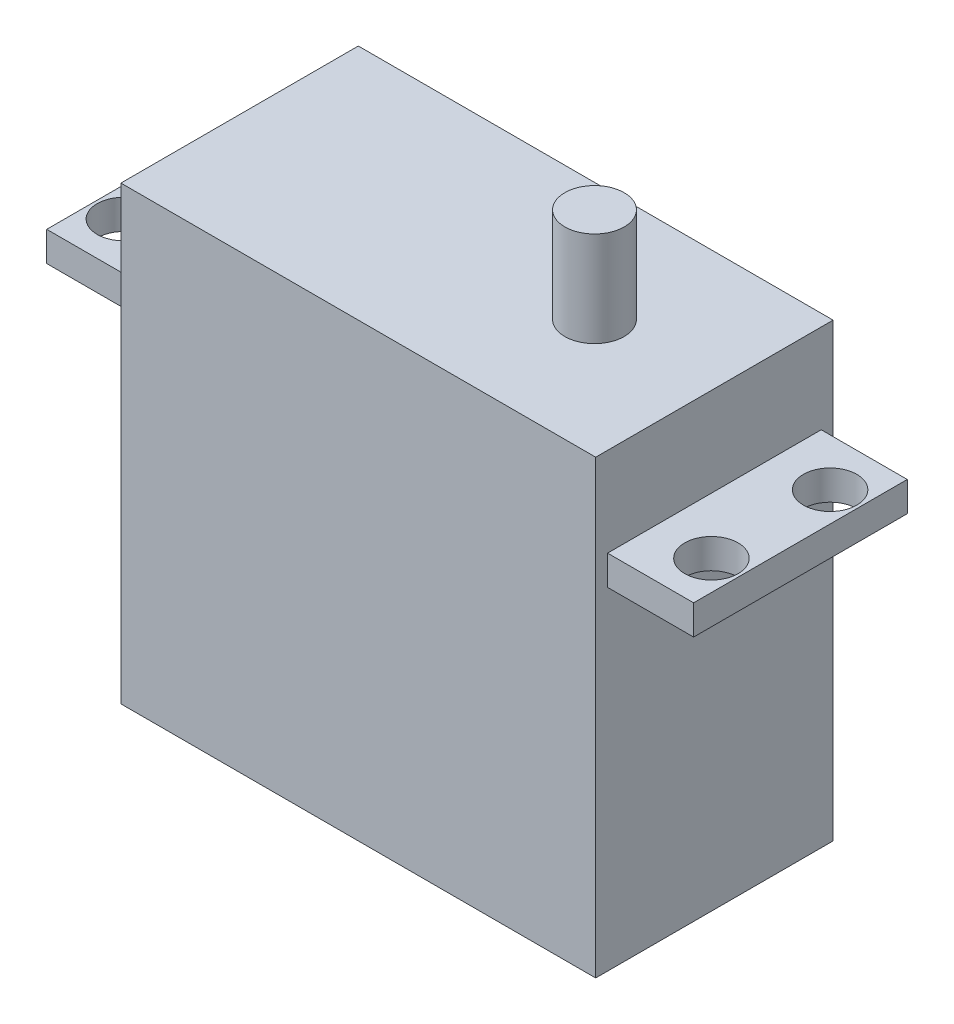
ISO-10303-21;
HEADER;
FILE_DESCRIPTION(('STEP AP214'),'2;1');
FILE_NAME('part.step','',(''),(''),'','','');
FILE_SCHEMA(('AUTOMOTIVE_DESIGN { 1 0 10303 214 1 1 1 1 }'));
ENDSEC;
DATA;
#1=APPLICATION_CONTEXT('core data for automotive mechanical design processes');
#2=APPLICATION_PROTOCOL_DEFINITION('international standard','automotive_design',2000,#1);
#3=PRODUCT_CONTEXT('',#1,'mechanical');
#4=PRODUCT('Part','Part','',(#3));
#5=PRODUCT_RELATED_PRODUCT_CATEGORY('part','',(#4));
#6=PRODUCT_DEFINITION_FORMATION('','',#4);
#7=PRODUCT_DEFINITION_CONTEXT('part definition',#1,'design');
#8=PRODUCT_DEFINITION('design','',#6,#7);
#9=PRODUCT_DEFINITION_SHAPE('','',#8);
#10=(LENGTH_UNIT() NAMED_UNIT(*) SI_UNIT(.MILLI.,.METRE.));
#11=(NAMED_UNIT(*) PLANE_ANGLE_UNIT() SI_UNIT($,.RADIAN.));
#12=(NAMED_UNIT(*) SI_UNIT($,.STERADIAN.) SOLID_ANGLE_UNIT());
#13=UNCERTAINTY_MEASURE_WITH_UNIT(LENGTH_MEASURE(1.E-05),#10,'distance_accuracy_value','');
#14=(GEOMETRIC_REPRESENTATION_CONTEXT(3) GLOBAL_UNCERTAINTY_ASSIGNED_CONTEXT((#13)) GLOBAL_UNIT_ASSIGNED_CONTEXT((#10,
#11,#12)) REPRESENTATION_CONTEXT('',''));
#15=CARTESIAN_POINT('',(0.,0.,0.));
#16=DIRECTION('',(0.,0.,1.));
#17=DIRECTION('',(1.,0.,0.));
#18=AXIS2_PLACEMENT_3D('',#15,#16,#17);
#19=CARTESIAN_POINT('',(-29.9,-28.,-10.));
#20=DIRECTION('',(-1.,0.,0.));
#21=DIRECTION('',(0.,0.,1.));
#22=AXIS2_PLACEMENT_3D('',#19,#20,#21);
#23=PLANE('',#22);
#24=DIRECTION('',(0.,1.,0.));
#25=VECTOR('',#24,1.);
#26=CARTESIAN_POINT('',(-29.9,-28.,10.));
#27=LINE('',#26,#25);
#28=CARTESIAN_POINT('',(-29.9,-28.,10.));
#29=VERTEX_POINT('',#28);
#30=CARTESIAN_POINT('',(-29.9,10.,10.));
#31=VERTEX_POINT('',#30);
#32=EDGE_CURVE('E225',#29,#31,#27,.T.);
#33=ORIENTED_EDGE('',*,*,#32,.T.);
#34=DIRECTION('',(0.,0.,1.));
#35=VECTOR('',#34,1.);
#36=CARTESIAN_POINT('',(-29.9,10.,-10.));
#37=LINE('',#36,#35);
#38=CARTESIAN_POINT('',(-29.9,10.,-10.));
#39=VERTEX_POINT('',#38);
#40=EDGE_CURVE('E200',#39,#31,#37,.T.);
#41=ORIENTED_EDGE('',*,*,#40,.F.);
#42=DIRECTION('',(0.,1.,0.));
#43=VECTOR('',#42,1.);
#44=CARTESIAN_POINT('',(-29.9,-28.,-10.));
#45=LINE('',#44,#43);
#46=CARTESIAN_POINT('',(-29.9,-28.,-10.));
#47=VERTEX_POINT('',#46);
#48=EDGE_CURVE('E11',#47,#39,#45,.T.);
#49=ORIENTED_EDGE('',*,*,#48,.F.);
#50=DIRECTION('',(0.,0.,1.));
#51=VECTOR('',#50,1.);
#52=CARTESIAN_POINT('',(-29.9,-28.,-10.));
#53=LINE('',#52,#51);
#54=EDGE_CURVE('E214',#47,#29,#53,.T.);
#55=ORIENTED_EDGE('',*,*,#54,.T.);
#56=EDGE_LOOP('',(#33,#41,#49,#55));
#57=FACE_BOUND('',#56,.T.);
#58=DIRECTION('',(0.,-1.,0.));
#59=VECTOR('',#58,1.);
#60=CARTESIAN_POINT('',(-29.9,2.5,-8.99999999999999));
#61=LINE('',#60,#59);
#62=CARTESIAN_POINT('',(-29.9,2.5,-8.99999999999999));
#63=VERTEX_POINT('',#62);
#64=CARTESIAN_POINT('',(-29.9,0.,-8.99999999999999));
#65=VERTEX_POINT('',#64);
#66=EDGE_CURVE('E48',#63,#65,#61,.T.);
#67=ORIENTED_EDGE('',*,*,#66,.F.);
#68=DIRECTION('',(0.,0.,1.));
#69=VECTOR('',#68,1.);
#70=CARTESIAN_POINT('',(-29.9,2.5,9.00000000000001));
#71=LINE('',#70,#69);
#72=CARTESIAN_POINT('',(-29.9,2.5,9.00000000000001));
#73=VERTEX_POINT('',#72);
#74=EDGE_CURVE('E52',#63,#73,#71,.T.);
#75=ORIENTED_EDGE('',*,*,#74,.T.);
#76=DIRECTION('',(0.,-1.,0.));
#77=VECTOR('',#76,1.);
#78=CARTESIAN_POINT('',(-29.9,2.5,9.00000000000001));
#79=LINE('',#78,#77);
#80=CARTESIAN_POINT('',(-29.9,0.,9.00000000000001));
#81=VERTEX_POINT('',#80);
#82=EDGE_CURVE('E141',#73,#81,#79,.T.);
#83=ORIENTED_EDGE('',*,*,#82,.T.);
#84=DIRECTION('',(0.,0.,1.));
#85=VECTOR('',#84,1.);
#86=CARTESIAN_POINT('',(-29.9,0.,9.00000000000001));
#87=LINE('',#86,#85);
#88=EDGE_CURVE('E145',#65,#81,#87,.T.);
#89=ORIENTED_EDGE('',*,*,#88,.F.);
#90=EDGE_LOOP('',(#67,#75,#83,#89));
#91=FACE_BOUND('',#90,.T.);
#92=ADVANCED_FACE('F32',(#57,#91),#23,.T.);
#93=CARTESIAN_POINT('',(10.1,-28.,-10.));
#94=DIRECTION('',(1.,0.,0.));
#95=DIRECTION('',(0.,0.,-1.));
#96=AXIS2_PLACEMENT_3D('',#93,#94,#95);
#97=PLANE('',#96);
#98=DIRECTION('',(0.,1.,0.));
#99=VECTOR('',#98,1.);
#100=CARTESIAN_POINT('',(10.1,-28.,-10.));
#101=LINE('',#100,#99);
#102=CARTESIAN_POINT('',(10.1,-28.,-10.));
#103=VERTEX_POINT('',#102);
#104=CARTESIAN_POINT('',(10.1,10.,-10.));
#105=VERTEX_POINT('',#104);
#106=EDGE_CURVE('E40',#103,#105,#101,.T.);
#107=ORIENTED_EDGE('',*,*,#106,.T.);
#108=DIRECTION('',(0.,0.,-1.));
#109=VECTOR('',#108,1.);
#110=CARTESIAN_POINT('',(10.1,10.,-10.));
#111=LINE('',#110,#109);
#112=CARTESIAN_POINT('',(10.1,10.,10.));
#113=VERTEX_POINT('',#112);
#114=EDGE_CURVE('E208',#113,#105,#111,.T.);
#115=ORIENTED_EDGE('',*,*,#114,.F.);
#116=DIRECTION('',(0.,1.,0.));
#117=VECTOR('',#116,1.);
#118=CARTESIAN_POINT('',(10.1,-28.,10.));
#119=LINE('',#118,#117);
#120=CARTESIAN_POINT('',(10.1,-28.,10.));
#121=VERTEX_POINT('',#120);
#122=EDGE_CURVE('E228',#121,#113,#119,.T.);
#123=ORIENTED_EDGE('',*,*,#122,.F.);
#124=DIRECTION('',(0.,0.,-1.));
#125=VECTOR('',#124,1.);
#126=CARTESIAN_POINT('',(10.1,-28.,-10.));
#127=LINE('',#126,#125);
#128=EDGE_CURVE('E220',#121,#103,#127,.T.);
#129=ORIENTED_EDGE('',*,*,#128,.T.);
#130=EDGE_LOOP('',(#107,#115,#123,#129));
#131=FACE_BOUND('',#130,.T.);
#132=DIRECTION('',(0.,-1.,0.));
#133=VECTOR('',#132,1.);
#134=CARTESIAN_POINT('',(10.1,2.5,9.));
#135=LINE('',#134,#133);
#136=CARTESIAN_POINT('',(10.1,2.5,9.));
#137=VERTEX_POINT('',#136);
#138=CARTESIAN_POINT('',(10.1,0.,9.));
#139=VERTEX_POINT('',#138);
#140=EDGE_CURVE('E193',#137,#139,#135,.T.);
#141=ORIENTED_EDGE('',*,*,#140,.F.);
#142=DIRECTION('',(0.,0.,1.));
#143=VECTOR('',#142,1.);
#144=CARTESIAN_POINT('',(10.1,2.5,9.));
#145=LINE('',#144,#143);
#146=CARTESIAN_POINT('',(10.1,2.5,-9.));
#147=VERTEX_POINT('',#146);
#148=EDGE_CURVE('E167',#147,#137,#145,.T.);
#149=ORIENTED_EDGE('',*,*,#148,.F.);
#150=DIRECTION('',(0.,-1.,0.));
#151=VECTOR('',#150,1.);
#152=CARTESIAN_POINT('',(10.1,2.5,-9.));
#153=LINE('',#152,#151);
#154=CARTESIAN_POINT('',(10.1,0.,-9.));
#155=VERTEX_POINT('',#154);
#156=EDGE_CURVE('E178',#147,#155,#153,.T.);
#157=ORIENTED_EDGE('',*,*,#156,.T.);
#158=DIRECTION('',(0.,0.,1.));
#159=VECTOR('',#158,1.);
#160=CARTESIAN_POINT('',(10.1,0.,9.));
#161=LINE('',#160,#159);
#162=EDGE_CURVE('E166',#155,#139,#161,.T.);
#163=ORIENTED_EDGE('',*,*,#162,.T.);
#164=EDGE_LOOP('',(#141,#149,#157,#163));
#165=FACE_BOUND('',#164,.T.);
#166=ADVANCED_FACE('F266',(#131,#165),#97,.T.);
#167=CARTESIAN_POINT('',(-29.9,-28.,-10.));
#168=DIRECTION('',(0.,0.,-1.));
#169=DIRECTION('',(-1.,0.,0.));
#170=AXIS2_PLACEMENT_3D('',#167,#168,#169);
#171=PLANE('',#170);
#172=ORIENTED_EDGE('',*,*,#48,.T.);
#173=DIRECTION('',(-1.,0.,0.));
#174=VECTOR('',#173,1.);
#175=CARTESIAN_POINT('',(-29.9,10.,-10.));
#176=LINE('',#175,#174);
#177=EDGE_CURVE('E211',#105,#39,#176,.T.);
#178=ORIENTED_EDGE('',*,*,#177,.F.);
#179=ORIENTED_EDGE('',*,*,#106,.F.);
#180=DIRECTION('',(-1.,0.,0.));
#181=VECTOR('',#180,1.);
#182=CARTESIAN_POINT('',(-29.9,-28.,-10.));
#183=LINE('',#182,#181);
#184=EDGE_CURVE('E223',#103,#47,#183,.T.);
#185=ORIENTED_EDGE('',*,*,#184,.T.);
#186=EDGE_LOOP('',(#172,#178,#179,#185));
#187=FACE_BOUND('',#186,.T.);
#188=ADVANCED_FACE('F271',(#187),#171,.T.);
#189=CARTESIAN_POINT('',(-29.9,-28.,10.));
#190=DIRECTION('',(0.,0.,1.));
#191=DIRECTION('',(1.,0.,0.));
#192=AXIS2_PLACEMENT_3D('',#189,#190,#191);
#193=PLANE('',#192);
#194=ORIENTED_EDGE('',*,*,#122,.T.);
#195=DIRECTION('',(1.,0.,0.));
#196=VECTOR('',#195,1.);
#197=CARTESIAN_POINT('',(-29.9,10.,10.));
#198=LINE('',#197,#196);
#199=EDGE_CURVE('E205',#31,#113,#198,.T.);
#200=ORIENTED_EDGE('',*,*,#199,.F.);
#201=ORIENTED_EDGE('',*,*,#32,.F.);
#202=DIRECTION('',(1.,0.,0.));
#203=VECTOR('',#202,1.);
#204=CARTESIAN_POINT('',(-29.9,-28.,10.));
#205=LINE('',#204,#203);
#206=EDGE_CURVE('E217',#29,#121,#205,.T.);
#207=ORIENTED_EDGE('',*,*,#206,.T.);
#208=EDGE_LOOP('',(#194,#200,#201,#207));
#209=FACE_BOUND('',#208,.T.);
#210=ADVANCED_FACE('F279',(#209),#193,.T.);
#211=CARTESIAN_POINT('',(0.,-28.,0.));
#212=DIRECTION('',(0.,1.,0.));
#213=DIRECTION('',(0.,0.,1.));
#214=AXIS2_PLACEMENT_3D('',#211,#212,#213);
#215=PLANE('',#214);
#216=ORIENTED_EDGE('',*,*,#54,.F.);
#217=ORIENTED_EDGE('',*,*,#184,.F.);
#218=ORIENTED_EDGE('',*,*,#128,.F.);
#219=ORIENTED_EDGE('',*,*,#206,.F.);
#220=EDGE_LOOP('',(#216,#217,#218,#219));
#221=FACE_BOUND('',#220,.T.);
#222=ADVANCED_FACE('F287',(#221),#215,.F.);
#223=CARTESIAN_POINT('',(0.,10.,0.));
#224=DIRECTION('',(0.,1.,0.));
#225=DIRECTION('',(0.,0.,1.));
#226=AXIS2_PLACEMENT_3D('',#223,#224,#225);
#227=PLANE('',#226);
#228=CARTESIAN_POINT('',(0.,10.,0.));
#229=DIRECTION('',(0.,1.,0.));
#230=DIRECTION('',(0.,0.,1.));
#231=AXIS2_PLACEMENT_3D('',#228,#229,#230);
#232=CIRCLE('',#231,2.5);
#233=CARTESIAN_POINT('',(0.,10.,2.5));
#234=VERTEX_POINT('',#233);
#235=EDGE_CURVE('E196',#234,#234,#232,.T.);
#236=ORIENTED_EDGE('',*,*,#235,.F.);
#237=EDGE_LOOP('',(#236));
#238=FACE_BOUND('',#237,.T.);
#239=ORIENTED_EDGE('',*,*,#40,.T.);
#240=ORIENTED_EDGE('',*,*,#199,.T.);
#241=ORIENTED_EDGE('',*,*,#114,.T.);
#242=ORIENTED_EDGE('',*,*,#177,.T.);
#243=EDGE_LOOP('',(#239,#240,#241,#242));
#244=FACE_BOUND('',#243,.T.);
#245=ADVANCED_FACE('F282',(#238,#244),#227,.T.);
#246=CARTESIAN_POINT('',(0.,18.,0.));
#247=DIRECTION('',(0.,-1.,0.));
#248=DIRECTION('',(0.,0.,-1.));
#249=AXIS2_PLACEMENT_3D('',#246,#247,#248);
#250=CYLINDRICAL_SURFACE('',#249,2.5);
#251=CARTESIAN_POINT('',(0.,18.,0.));
#252=DIRECTION('',(0.,1.,0.));
#253=DIRECTION('',(0.,0.,1.));
#254=AXIS2_PLACEMENT_3D('',#251,#252,#253);
#255=CIRCLE('',#254,2.5);
#256=CARTESIAN_POINT('',(0.,18.,2.5));
#257=VERTEX_POINT('',#256);
#258=EDGE_CURVE('E197',#257,#257,#255,.T.);
#259=ORIENTED_EDGE('',*,*,#258,.F.);
#260=EDGE_LOOP('',(#259));
#261=FACE_BOUND('',#260,.T.);
#262=ORIENTED_EDGE('',*,*,#235,.T.);
#263=EDGE_LOOP('',(#262));
#264=FACE_BOUND('',#263,.T.);
#265=ADVANCED_FACE('F323',(#261,#264),#250,.T.);
#266=CARTESIAN_POINT('',(0.,18.,0.));
#267=DIRECTION('',(0.,1.,0.));
#268=DIRECTION('',(0.,0.,1.));
#269=AXIS2_PLACEMENT_3D('',#266,#267,#268);
#270=PLANE('',#269);
#271=ORIENTED_EDGE('',*,*,#258,.T.);
#272=EDGE_LOOP('',(#271));
#273=FACE_BOUND('',#272,.T.);
#274=ADVANCED_FACE('F317',(#273),#270,.T.);
#275=CARTESIAN_POINT('',(10.1,2.5,9.));
#276=DIRECTION('',(0.,0.,-1.));
#277=DIRECTION('',(-1.,0.,0.));
#278=AXIS2_PLACEMENT_3D('',#275,#276,#277);
#279=PLANE('',#278);
#280=DIRECTION('',(1.,0.,0.));
#281=VECTOR('',#280,1.);
#282=CARTESIAN_POINT('',(10.1,0.,9.));
#283=LINE('',#282,#281);
#284=CARTESIAN_POINT('',(17.35,0.,9.));
#285=VERTEX_POINT('',#284);
#286=EDGE_CURVE('E180',#139,#285,#283,.T.);
#287=ORIENTED_EDGE('',*,*,#286,.T.);
#288=DIRECTION('',(0.,-1.,0.));
#289=VECTOR('',#288,1.);
#290=CARTESIAN_POINT('',(17.35,2.5,9.));
#291=LINE('',#290,#289);
#292=CARTESIAN_POINT('',(17.35,2.5,9.));
#293=VERTEX_POINT('',#292);
#294=EDGE_CURVE('E190',#293,#285,#291,.T.);
#295=ORIENTED_EDGE('',*,*,#294,.F.);
#296=DIRECTION('',(1.,0.,0.));
#297=VECTOR('',#296,1.);
#298=CARTESIAN_POINT('',(10.1,2.5,9.));
#299=LINE('',#298,#297);
#300=EDGE_CURVE('E170',#137,#293,#299,.T.);
#301=ORIENTED_EDGE('',*,*,#300,.F.);
#302=ORIENTED_EDGE('',*,*,#140,.T.);
#303=EDGE_LOOP('',(#287,#295,#301,#302));
#304=FACE_BOUND('',#303,.T.);
#305=ADVANCED_FACE('F295',(#304),#279,.F.);
#306=CARTESIAN_POINT('',(17.35,2.5,9.));
#307=DIRECTION('',(-1.,0.,0.));
#308=DIRECTION('',(0.,0.,1.));
#309=AXIS2_PLACEMENT_3D('',#306,#307,#308);
#310=PLANE('',#309);
#311=DIRECTION('',(0.,0.,-1.));
#312=VECTOR('',#311,1.);
#313=CARTESIAN_POINT('',(17.35,0.,9.));
#314=LINE('',#313,#312);
#315=CARTESIAN_POINT('',(17.35,0.,-9.));
#316=VERTEX_POINT('',#315);
#317=EDGE_CURVE('E182',#285,#316,#314,.T.);
#318=ORIENTED_EDGE('',*,*,#317,.T.);
#319=DIRECTION('',(0.,-1.,0.));
#320=VECTOR('',#319,1.);
#321=CARTESIAN_POINT('',(17.35,2.5,-9.));
#322=LINE('',#321,#320);
#323=CARTESIAN_POINT('',(17.35,2.5,-9.));
#324=VERTEX_POINT('',#323);
#325=EDGE_CURVE('E187',#324,#316,#322,.T.);
#326=ORIENTED_EDGE('',*,*,#325,.F.);
#327=DIRECTION('',(0.,0.,-1.));
#328=VECTOR('',#327,1.);
#329=CARTESIAN_POINT('',(17.35,2.5,9.));
#330=LINE('',#329,#328);
#331=EDGE_CURVE('E173',#293,#324,#330,.T.);
#332=ORIENTED_EDGE('',*,*,#331,.F.);
#333=ORIENTED_EDGE('',*,*,#294,.T.);
#334=EDGE_LOOP('',(#318,#326,#332,#333));
#335=FACE_BOUND('',#334,.T.);
#336=ADVANCED_FACE('F309',(#335),#310,.F.);
#337=CARTESIAN_POINT('',(10.1,2.5,-9.));
#338=DIRECTION('',(0.,0.,1.));
#339=DIRECTION('',(1.,0.,0.));
#340=AXIS2_PLACEMENT_3D('',#337,#338,#339);
#341=PLANE('',#340);
#342=DIRECTION('',(-1.,0.,0.));
#343=VECTOR('',#342,1.);
#344=CARTESIAN_POINT('',(10.1,0.,-9.));
#345=LINE('',#344,#343);
#346=EDGE_CURVE('E171',#316,#155,#345,.T.);
#347=ORIENTED_EDGE('',*,*,#346,.T.);
#348=ORIENTED_EDGE('',*,*,#156,.F.);
#349=DIRECTION('',(-1.,0.,0.));
#350=VECTOR('',#349,1.);
#351=CARTESIAN_POINT('',(10.1,2.5,-9.));
#352=LINE('',#351,#350);
#353=EDGE_CURVE('E175',#324,#147,#352,.T.);
#354=ORIENTED_EDGE('',*,*,#353,.F.);
#355=ORIENTED_EDGE('',*,*,#325,.T.);
#356=EDGE_LOOP('',(#347,#348,#354,#355));
#357=FACE_BOUND('',#356,.T.);
#358=ADVANCED_FACE('F303',(#357),#341,.F.);
#359=CARTESIAN_POINT('',(0.,2.5,0.));
#360=DIRECTION('',(0.,-1.,0.));
#361=DIRECTION('',(0.,0.,-1.));
#362=AXIS2_PLACEMENT_3D('',#359,#360,#361);
#363=PLANE('',#362);
#364=CARTESIAN_POINT('',(14.85,2.5,5.));
#365=DIRECTION('',(0.,-1.,0.));
#366=DIRECTION('',(0.,0.,-1.));
#367=AXIS2_PLACEMENT_3D('',#364,#365,#366);
#368=CIRCLE('',#367,2.25);
#369=CARTESIAN_POINT('',(14.85,2.5,7.25));
#370=VERTEX_POINT('',#369);
#371=EDGE_CURVE('E163',#370,#370,#368,.T.);
#372=ORIENTED_EDGE('',*,*,#371,.T.);
#373=EDGE_LOOP('',(#372));
#374=FACE_BOUND('',#373,.T.);
#375=CARTESIAN_POINT('',(14.85,2.5,-5.));
#376=DIRECTION('',(0.,-1.,0.));
#377=DIRECTION('',(0.,0.,-1.));
#378=AXIS2_PLACEMENT_3D('',#375,#376,#377);
#379=CIRCLE('',#378,2.25);
#380=CARTESIAN_POINT('',(14.85,2.5,-2.75));
#381=VERTEX_POINT('',#380);
#382=EDGE_CURVE('E159',#381,#381,#379,.T.);
#383=ORIENTED_EDGE('',*,*,#382,.T.);
#384=EDGE_LOOP('',(#383));
#385=FACE_BOUND('',#384,.T.);
#386=ORIENTED_EDGE('',*,*,#148,.T.);
#387=ORIENTED_EDGE('',*,*,#300,.T.);
#388=ORIENTED_EDGE('',*,*,#331,.T.);
#389=ORIENTED_EDGE('',*,*,#353,.T.);
#390=EDGE_LOOP('',(#386,#387,#388,#389));
#391=FACE_BOUND('',#390,.T.);
#392=ADVANCED_FACE('F298',(#374,#385,#391),#363,.F.);
#393=CARTESIAN_POINT('',(0.,0.,0.));
#394=DIRECTION('',(0.,-1.,0.));
#395=DIRECTION('',(0.,0.,-1.));
#396=AXIS2_PLACEMENT_3D('',#393,#394,#395);
#397=PLANE('',#396);
#398=CARTESIAN_POINT('',(14.85,0.,5.));
#399=DIRECTION('',(0.,-1.,0.));
#400=DIRECTION('',(0.,0.,-1.));
#401=AXIS2_PLACEMENT_3D('',#398,#399,#400);
#402=CIRCLE('',#401,2.25);
#403=CARTESIAN_POINT('',(14.85,0.,7.25));
#404=VERTEX_POINT('',#403);
#405=EDGE_CURVE('E162',#404,#404,#402,.T.);
#406=ORIENTED_EDGE('',*,*,#405,.F.);
#407=EDGE_LOOP('',(#406));
#408=FACE_BOUND('',#407,.T.);
#409=CARTESIAN_POINT('',(14.85,0.,-5.));
#410=DIRECTION('',(0.,-1.,0.));
#411=DIRECTION('',(0.,0.,-1.));
#412=AXIS2_PLACEMENT_3D('',#409,#410,#411);
#413=CIRCLE('',#412,2.25);
#414=CARTESIAN_POINT('',(14.85,0.,-2.75));
#415=VERTEX_POINT('',#414);
#416=EDGE_CURVE('E158',#415,#415,#413,.T.);
#417=ORIENTED_EDGE('',*,*,#416,.F.);
#418=EDGE_LOOP('',(#417));
#419=FACE_BOUND('',#418,.T.);
#420=ORIENTED_EDGE('',*,*,#162,.F.);
#421=ORIENTED_EDGE('',*,*,#346,.F.);
#422=ORIENTED_EDGE('',*,*,#317,.F.);
#423=ORIENTED_EDGE('',*,*,#286,.F.);
#424=EDGE_LOOP('',(#420,#421,#422,#423));
#425=FACE_BOUND('',#424,.T.);
#426=ADVANCED_FACE('F307',(#408,#419,#425),#397,.T.);
#427=CARTESIAN_POINT('',(14.85,-28.,-5.));
#428=DIRECTION('',(0.,1.,0.));
#429=DIRECTION('',(0.,0.,1.));
#430=AXIS2_PLACEMENT_3D('',#427,#428,#429);
#431=CYLINDRICAL_SURFACE('',#430,2.25);
#432=CARTESIAN_POINT('',(14.85,0.,-2.75));
#433=CARTESIAN_POINT('',(14.85,0.0260416666666661,-2.75));
#434=CARTESIAN_POINT('',(14.85,0.0520833333333322,-2.75));
#435=CARTESIAN_POINT('',(14.85,0.104166666666666,-2.75));
#436=CARTESIAN_POINT('',(14.85,0.130208333333333,-2.75));
#437=CARTESIAN_POINT('',(14.85,0.182291666666667,-2.75));
#438=CARTESIAN_POINT('',(14.85,0.208333333333335,-2.75));
#439=CARTESIAN_POINT('',(14.85,0.260416666666668,-2.75));
#440=CARTESIAN_POINT('',(14.85,0.286458333333334,-2.75));
#441=CARTESIAN_POINT('',(14.85,0.338541666666666,-2.75));
#442=CARTESIAN_POINT('',(14.85,0.364583333333332,-2.75));
#443=CARTESIAN_POINT('',(14.85,0.416666666666666,-2.75));
#444=CARTESIAN_POINT('',(14.85,0.442708333333333,-2.75));
#445=CARTESIAN_POINT('',(14.85,0.494791666666668,-2.75));
#446=CARTESIAN_POINT('',(14.85,0.520833333333335,-2.75));
#447=CARTESIAN_POINT('',(14.85,0.572916666666668,-2.75));
#448=CARTESIAN_POINT('',(14.85,0.598958333333334,-2.75));
#449=CARTESIAN_POINT('',(14.85,0.651041666666667,-2.75));
#450=CARTESIAN_POINT('',(14.85,0.677083333333333,-2.75));
#451=CARTESIAN_POINT('',(14.85,0.729166666666666,-2.75));
#452=CARTESIAN_POINT('',(14.85,0.755208333333333,-2.75));
#453=CARTESIAN_POINT('',(14.85,0.807291666666668,-2.75));
#454=CARTESIAN_POINT('',(14.85,0.833333333333335,-2.75));
#455=CARTESIAN_POINT('',(14.85,0.885416666666669,-2.75));
#456=CARTESIAN_POINT('',(14.85,0.911458333333335,-2.75));
#457=CARTESIAN_POINT('',(14.85,0.963541666666667,-2.75));
#458=CARTESIAN_POINT('',(14.85,0.989583333333333,-2.75));
#459=CARTESIAN_POINT('',(14.85,1.04166666666667,-2.75));
#460=CARTESIAN_POINT('',(14.85,1.06770833333333,-2.75));
#461=CARTESIAN_POINT('',(14.85,1.11979166666667,-2.75));
#462=CARTESIAN_POINT('',(14.85,1.14583333333334,-2.75));
#463=CARTESIAN_POINT('',(14.85,1.19791666666667,-2.75));
#464=CARTESIAN_POINT('',(14.85,1.22395833333334,-2.75));
#465=CARTESIAN_POINT('',(14.85,1.27604166666667,-2.75));
#466=CARTESIAN_POINT('',(14.85,1.30208333333333,-2.75));
#467=CARTESIAN_POINT('',(14.85,1.35416666666667,-2.75));
#468=CARTESIAN_POINT('',(14.85,1.38020833333333,-2.75));
#469=CARTESIAN_POINT('',(14.85,1.43229166666667,-2.75));
#470=CARTESIAN_POINT('',(14.85,1.45833333333334,-2.75));
#471=CARTESIAN_POINT('',(14.85,1.51041666666667,-2.75));
#472=CARTESIAN_POINT('',(14.85,1.53645833333334,-2.75));
#473=CARTESIAN_POINT('',(14.85,1.58854166666667,-2.75));
#474=CARTESIAN_POINT('',(14.85,1.61458333333333,-2.75));
#475=CARTESIAN_POINT('',(14.85,1.66666666666667,-2.75));
#476=CARTESIAN_POINT('',(14.85,1.69270833333333,-2.75));
#477=CARTESIAN_POINT('',(14.85,1.74479166666667,-2.75));
#478=CARTESIAN_POINT('',(14.85,1.77083333333334,-2.75));
#479=CARTESIAN_POINT('',(14.85,1.82291666666667,-2.75));
#480=CARTESIAN_POINT('',(14.85,1.84895833333334,-2.75));
#481=CARTESIAN_POINT('',(14.85,1.90104166666667,-2.75));
#482=CARTESIAN_POINT('',(14.85,1.92708333333333,-2.75));
#483=CARTESIAN_POINT('',(14.85,1.97916666666667,-2.75));
#484=CARTESIAN_POINT('',(14.85,2.00520833333333,-2.75));
#485=CARTESIAN_POINT('',(14.85,2.05729166666667,-2.75));
#486=CARTESIAN_POINT('',(14.85,2.08333333333334,-2.75));
#487=CARTESIAN_POINT('',(14.85,2.13541666666667,-2.75));
#488=CARTESIAN_POINT('',(14.85,2.16145833333334,-2.75));
#489=CARTESIAN_POINT('',(14.85,2.21354166666667,-2.75));
#490=CARTESIAN_POINT('',(14.85,2.23958333333333,-2.75));
#491=CARTESIAN_POINT('',(14.85,2.29166666666667,-2.75));
#492=CARTESIAN_POINT('',(14.85,2.31770833333333,-2.75));
#493=CARTESIAN_POINT('',(14.85,2.36979166666667,-2.75));
#494=CARTESIAN_POINT('',(14.85,2.39583333333334,-2.75));
#495=CARTESIAN_POINT('',(14.85,2.44791666666667,-2.75));
#496=CARTESIAN_POINT('',(14.85,2.47395833333334,-2.75));
#497=CARTESIAN_POINT('',(14.85,2.5,-2.75));
#498=B_SPLINE_CURVE_WITH_KNOTS('',3,(#432,#433,#434,#435,#436,#437,#438,#439,#440,#441,#442,
#443,#444,#445,#446,#447,#448,#449,#450,#451,#452,#453,#454,#455,#456,#457,#458,#459,#460,#461,
#462,#463,#464,#465,#466,#467,#468,#469,#470,#471,#472,#473,#474,#475,#476,#477,#478,#479,#480,
#481,#482,#483,#484,#485,#486,#487,#488,#489,#490,#491,#492,#493,#494,#495,#496,#497),
.UNSPECIFIED.,.F.,.F.,(4,2,2,2,2,2,2,2,2,2,2,2,2,2,2,2,2,2,2,2,2,2,2,2,2,2,2,2,2,2,2,2,4),(0.,
0.0781249999999983,0.15625,0.234375000000002,0.3125,0.390624999999999,0.46875,0.546875000000002,
0.625000000000001,0.703124999999999,0.781250000000001,0.859375000000002,0.937500000000001,
1.015625,1.09375,1.171875,1.25,1.328125,1.40625,1.484375,1.5625,1.640625,1.71875,1.796875,1.875,
1.953125,2.03125,2.109375,2.1875,2.265625,2.34375,2.421875,2.5),.UNSPECIFIED.);
#499=EDGE_CURVE('BSEAM390',#415,#381,#498,.T.);
#500=ORIENTED_EDGE('',*,*,#416,.T.);
#501=ORIENTED_EDGE('',*,*,#382,.F.);
#502=ORIENTED_EDGE('',*,*,#499,.T.);
#503=ORIENTED_EDGE('',*,*,#499,.F.);
#504=EDGE_LOOP('',(#500,#502,#501,#503));
#505=FACE_BOUND('',#504,.T.);
#506=ADVANCED_FACE('F390',(#505),#431,.F.);
#507=CARTESIAN_POINT('',(14.85,-28.,5.));
#508=DIRECTION('',(0.,1.,0.));
#509=DIRECTION('',(0.,0.,1.));
#510=AXIS2_PLACEMENT_3D('',#507,#508,#509);
#511=CYLINDRICAL_SURFACE('',#510,2.25);
#512=CARTESIAN_POINT('',(14.85,0.,7.25));
#513=CARTESIAN_POINT('',(14.85,0.0260416666666661,7.25));
#514=CARTESIAN_POINT('',(14.85,0.0520833333333322,7.25));
#515=CARTESIAN_POINT('',(14.85,0.104166666666666,7.25));
#516=CARTESIAN_POINT('',(14.85,0.130208333333333,7.25));
#517=CARTESIAN_POINT('',(14.85,0.182291666666667,7.25));
#518=CARTESIAN_POINT('',(14.85,0.208333333333335,7.25));
#519=CARTESIAN_POINT('',(14.85,0.260416666666668,7.25));
#520=CARTESIAN_POINT('',(14.85,0.286458333333334,7.25));
#521=CARTESIAN_POINT('',(14.85,0.338541666666666,7.25));
#522=CARTESIAN_POINT('',(14.85,0.364583333333332,7.25));
#523=CARTESIAN_POINT('',(14.85,0.416666666666666,7.25));
#524=CARTESIAN_POINT('',(14.85,0.442708333333333,7.25));
#525=CARTESIAN_POINT('',(14.85,0.494791666666668,7.25));
#526=CARTESIAN_POINT('',(14.85,0.520833333333335,7.25));
#527=CARTESIAN_POINT('',(14.85,0.572916666666668,7.25));
#528=CARTESIAN_POINT('',(14.85,0.598958333333334,7.25));
#529=CARTESIAN_POINT('',(14.85,0.651041666666667,7.25));
#530=CARTESIAN_POINT('',(14.85,0.677083333333333,7.25));
#531=CARTESIAN_POINT('',(14.85,0.729166666666666,7.25));
#532=CARTESIAN_POINT('',(14.85,0.755208333333333,7.25));
#533=CARTESIAN_POINT('',(14.85,0.807291666666668,7.25));
#534=CARTESIAN_POINT('',(14.85,0.833333333333335,7.25));
#535=CARTESIAN_POINT('',(14.85,0.885416666666669,7.25));
#536=CARTESIAN_POINT('',(14.85,0.911458333333335,7.25));
#537=CARTESIAN_POINT('',(14.85,0.963541666666667,7.25));
#538=CARTESIAN_POINT('',(14.85,0.989583333333333,7.25));
#539=CARTESIAN_POINT('',(14.85,1.04166666666667,7.25));
#540=CARTESIAN_POINT('',(14.85,1.06770833333333,7.25));
#541=CARTESIAN_POINT('',(14.85,1.11979166666667,7.25));
#542=CARTESIAN_POINT('',(14.85,1.14583333333334,7.25));
#543=CARTESIAN_POINT('',(14.85,1.19791666666667,7.25));
#544=CARTESIAN_POINT('',(14.85,1.22395833333334,7.25));
#545=CARTESIAN_POINT('',(14.85,1.27604166666667,7.25));
#546=CARTESIAN_POINT('',(14.85,1.30208333333333,7.25));
#547=CARTESIAN_POINT('',(14.85,1.35416666666667,7.25));
#548=CARTESIAN_POINT('',(14.85,1.38020833333333,7.25));
#549=CARTESIAN_POINT('',(14.85,1.43229166666667,7.25));
#550=CARTESIAN_POINT('',(14.85,1.45833333333334,7.25));
#551=CARTESIAN_POINT('',(14.85,1.51041666666667,7.25));
#552=CARTESIAN_POINT('',(14.85,1.53645833333334,7.25));
#553=CARTESIAN_POINT('',(14.85,1.58854166666667,7.25));
#554=CARTESIAN_POINT('',(14.85,1.61458333333333,7.25));
#555=CARTESIAN_POINT('',(14.85,1.66666666666667,7.25));
#556=CARTESIAN_POINT('',(14.85,1.69270833333333,7.25));
#557=CARTESIAN_POINT('',(14.85,1.74479166666667,7.25));
#558=CARTESIAN_POINT('',(14.85,1.77083333333334,7.25));
#559=CARTESIAN_POINT('',(14.85,1.82291666666667,7.25));
#560=CARTESIAN_POINT('',(14.85,1.84895833333334,7.25));
#561=CARTESIAN_POINT('',(14.85,1.90104166666667,7.25));
#562=CARTESIAN_POINT('',(14.85,1.92708333333333,7.25));
#563=CARTESIAN_POINT('',(14.85,1.97916666666667,7.25));
#564=CARTESIAN_POINT('',(14.85,2.00520833333333,7.25));
#565=CARTESIAN_POINT('',(14.85,2.05729166666667,7.25));
#566=CARTESIAN_POINT('',(14.85,2.08333333333334,7.25));
#567=CARTESIAN_POINT('',(14.85,2.13541666666667,7.25));
#568=CARTESIAN_POINT('',(14.85,2.16145833333334,7.25));
#569=CARTESIAN_POINT('',(14.85,2.21354166666667,7.25));
#570=CARTESIAN_POINT('',(14.85,2.23958333333333,7.25));
#571=CARTESIAN_POINT('',(14.85,2.29166666666667,7.25));
#572=CARTESIAN_POINT('',(14.85,2.31770833333333,7.25));
#573=CARTESIAN_POINT('',(14.85,2.36979166666667,7.25));
#574=CARTESIAN_POINT('',(14.85,2.39583333333334,7.25));
#575=CARTESIAN_POINT('',(14.85,2.44791666666667,7.25));
#576=CARTESIAN_POINT('',(14.85,2.47395833333334,7.25));
#577=CARTESIAN_POINT('',(14.85,2.5,7.25));
#578=B_SPLINE_CURVE_WITH_KNOTS('',3,(#512,#513,#514,#515,#516,#517,#518,#519,#520,#521,#522,
#523,#524,#525,#526,#527,#528,#529,#530,#531,#532,#533,#534,#535,#536,#537,#538,#539,#540,#541,
#542,#543,#544,#545,#546,#547,#548,#549,#550,#551,#552,#553,#554,#555,#556,#557,#558,#559,#560,
#561,#562,#563,#564,#565,#566,#567,#568,#569,#570,#571,#572,#573,#574,#575,#576,#577),
.UNSPECIFIED.,.F.,.F.,(4,2,2,2,2,2,2,2,2,2,2,2,2,2,2,2,2,2,2,2,2,2,2,2,2,2,2,2,2,2,2,2,4),(0.,
0.0781249999999983,0.15625,0.234375000000002,0.3125,0.390624999999999,0.46875,0.546875000000002,
0.625000000000001,0.703124999999999,0.781250000000001,0.859375000000002,0.937500000000001,
1.015625,1.09375,1.171875,1.25,1.328125,1.40625,1.484375,1.5625,1.640625,1.71875,1.796875,1.875,
1.953125,2.03125,2.109375,2.1875,2.265625,2.34375,2.421875,2.5),.UNSPECIFIED.);
#579=EDGE_CURVE('BSEAM399',#404,#370,#578,.T.);
#580=ORIENTED_EDGE('',*,*,#405,.T.);
#581=ORIENTED_EDGE('',*,*,#371,.F.);
#582=ORIENTED_EDGE('',*,*,#579,.T.);
#583=ORIENTED_EDGE('',*,*,#579,.F.);
#584=EDGE_LOOP('',(#580,#582,#581,#583));
#585=FACE_BOUND('',#584,.T.);
#586=ADVANCED_FACE('F399',(#585),#511,.F.);
#587=CARTESIAN_POINT('',(-29.9,2.5,-8.99999999999999));
#588=DIRECTION('',(0.,0.,-1.));
#589=DIRECTION('',(-1.,0.,0.));
#590=AXIS2_PLACEMENT_3D('',#587,#588,#589);
#591=PLANE('',#590);
#592=DIRECTION('',(1.,0.,0.));
#593=VECTOR('',#592,1.);
#594=CARTESIAN_POINT('',(-29.9,0.,-8.99999999999999));
#595=LINE('',#594,#593);
#596=CARTESIAN_POINT('',(-37.15,0.,-8.99999999999999));
#597=VERTEX_POINT('',#596);
#598=EDGE_CURVE('E124',#597,#65,#595,.T.);
#599=ORIENTED_EDGE('',*,*,#598,.F.);
#600=DIRECTION('',(0.,-1.,0.));
#601=VECTOR('',#600,1.);
#602=CARTESIAN_POINT('',(-37.15,2.5,-8.99999999999999));
#603=LINE('',#602,#601);
#604=CARTESIAN_POINT('',(-37.15,2.5,-8.99999999999999));
#605=VERTEX_POINT('',#604);
#606=EDGE_CURVE('E119',#605,#597,#603,.T.);
#607=ORIENTED_EDGE('',*,*,#606,.F.);
#608=DIRECTION('',(1.,0.,0.));
#609=VECTOR('',#608,1.);
#610=CARTESIAN_POINT('',(-29.9,2.5,-8.99999999999999));
#611=LINE('',#610,#609);
#612=EDGE_CURVE('E122',#605,#63,#611,.T.);
#613=ORIENTED_EDGE('',*,*,#612,.T.);
#614=ORIENTED_EDGE('',*,*,#66,.T.);
#615=EDGE_LOOP('',(#599,#607,#613,#614));
#616=FACE_BOUND('',#615,.T.);
#617=ADVANCED_FACE('F121',(#616),#591,.T.);
#618=CARTESIAN_POINT('',(-37.15,2.5,9.00000000000001));
#619=DIRECTION('',(-1.,0.,0.));
#620=DIRECTION('',(0.,0.,1.));
#621=AXIS2_PLACEMENT_3D('',#618,#619,#620);
#622=PLANE('',#621);
#623=DIRECTION('',(0.,0.,-1.));
#624=VECTOR('',#623,1.);
#625=CARTESIAN_POINT('',(-37.15,0.,9.00000000000001));
#626=LINE('',#625,#624);
#627=CARTESIAN_POINT('',(-37.15,0.,9.00000000000001));
#628=VERTEX_POINT('',#627);
#629=EDGE_CURVE('E150',#628,#597,#626,.T.);
#630=ORIENTED_EDGE('',*,*,#629,.F.);
#631=DIRECTION('',(0.,-1.,0.));
#632=VECTOR('',#631,1.);
#633=CARTESIAN_POINT('',(-37.15,2.5,9.00000000000001));
#634=LINE('',#633,#632);
#635=CARTESIAN_POINT('',(-37.15,2.5,9.00000000000001));
#636=VERTEX_POINT('',#635);
#637=EDGE_CURVE('E129',#636,#628,#634,.T.);
#638=ORIENTED_EDGE('',*,*,#637,.F.);
#639=DIRECTION('',(0.,0.,-1.));
#640=VECTOR('',#639,1.);
#641=CARTESIAN_POINT('',(-37.15,2.5,9.00000000000001));
#642=LINE('',#641,#640);
#643=EDGE_CURVE('E135',#636,#605,#642,.T.);
#644=ORIENTED_EDGE('',*,*,#643,.T.);
#645=ORIENTED_EDGE('',*,*,#606,.T.);
#646=EDGE_LOOP('',(#630,#638,#644,#645));
#647=FACE_BOUND('',#646,.T.);
#648=ADVANCED_FACE('F138',(#647),#622,.T.);
#649=CARTESIAN_POINT('',(-29.9,2.5,9.00000000000001));
#650=DIRECTION('',(0.,0.,1.));
#651=DIRECTION('',(1.,0.,0.));
#652=AXIS2_PLACEMENT_3D('',#649,#650,#651);
#653=PLANE('',#652);
#654=DIRECTION('',(-1.,0.,0.));
#655=VECTOR('',#654,1.);
#656=CARTESIAN_POINT('',(-29.9,0.,9.00000000000001));
#657=LINE('',#656,#655);
#658=EDGE_CURVE('E152',#81,#628,#657,.T.);
#659=ORIENTED_EDGE('',*,*,#658,.F.);
#660=ORIENTED_EDGE('',*,*,#82,.F.);
#661=DIRECTION('',(-1.,0.,0.));
#662=VECTOR('',#661,1.);
#663=CARTESIAN_POINT('',(-29.9,2.5,9.00000000000001));
#664=LINE('',#663,#662);
#665=EDGE_CURVE('E139',#73,#636,#664,.T.);
#666=ORIENTED_EDGE('',*,*,#665,.T.);
#667=ORIENTED_EDGE('',*,*,#637,.T.);
#668=EDGE_LOOP('',(#659,#660,#666,#667));
#669=FACE_BOUND('',#668,.T.);
#670=ADVANCED_FACE('F253',(#669),#653,.T.);
#671=CARTESIAN_POINT('',(-19.8,2.5,0.));
#672=DIRECTION('',(0.,-1.,0.));
#673=DIRECTION('',(0.,0.,-1.));
#674=AXIS2_PLACEMENT_3D('',#671,#672,#673);
#675=PLANE('',#674);
#676=CARTESIAN_POINT('',(-34.65,2.5,5.00000000000001));
#677=DIRECTION('',(0.,-1.,0.));
#678=DIRECTION('',(0.,0.,-1.));
#679=AXIS2_PLACEMENT_3D('',#676,#677,#678);
#680=CIRCLE('',#679,2.25);
#681=CARTESIAN_POINT('',(-34.65,2.5,7.25000000000001));
#682=VERTEX_POINT('',#681);
#683=EDGE_CURVE('E148',#682,#682,#680,.F.);
#684=ORIENTED_EDGE('',*,*,#683,.F.);
#685=EDGE_LOOP('',(#684));
#686=FACE_BOUND('',#685,.T.);
#687=CARTESIAN_POINT('',(-34.65,2.5,-4.99999999999999));
#688=DIRECTION('',(0.,-1.,0.));
#689=DIRECTION('',(0.,0.,-1.));
#690=AXIS2_PLACEMENT_3D('',#687,#688,#689);
#691=CIRCLE('',#690,2.25);
#692=CARTESIAN_POINT('',(-34.65,2.5,-2.74999999999999));
#693=VERTEX_POINT('',#692);
#694=EDGE_CURVE('E236',#693,#693,#691,.F.);
#695=ORIENTED_EDGE('',*,*,#694,.F.);
#696=EDGE_LOOP('',(#695));
#697=FACE_BOUND('',#696,.T.);
#698=ORIENTED_EDGE('',*,*,#74,.F.);
#699=ORIENTED_EDGE('',*,*,#612,.F.);
#700=ORIENTED_EDGE('',*,*,#643,.F.);
#701=ORIENTED_EDGE('',*,*,#665,.F.);
#702=EDGE_LOOP('',(#698,#699,#700,#701));
#703=FACE_BOUND('',#702,.T.);
#704=ADVANCED_FACE('F133',(#686,#697,#703),#675,.F.);
#705=CARTESIAN_POINT('',(-19.8,0.,0.));
#706=DIRECTION('',(0.,-1.,0.));
#707=DIRECTION('',(0.,0.,-1.));
#708=AXIS2_PLACEMENT_3D('',#705,#706,#707);
#709=PLANE('',#708);
#710=CARTESIAN_POINT('',(-34.65,0.,5.00000000000001));
#711=DIRECTION('',(0.,-1.,0.));
#712=DIRECTION('',(0.,0.,-1.));
#713=AXIS2_PLACEMENT_3D('',#710,#711,#712);
#714=CIRCLE('',#713,2.25);
#715=CARTESIAN_POINT('',(-34.65,0.,7.25000000000001));
#716=VERTEX_POINT('',#715);
#717=EDGE_CURVE('E35',#716,#716,#714,.F.);
#718=ORIENTED_EDGE('',*,*,#717,.T.);
#719=EDGE_LOOP('',(#718));
#720=FACE_BOUND('',#719,.T.);
#721=CARTESIAN_POINT('',(-34.65,0.,-4.99999999999999));
#722=DIRECTION('',(0.,-1.,0.));
#723=DIRECTION('',(0.,0.,-1.));
#724=AXIS2_PLACEMENT_3D('',#721,#722,#723);
#725=CIRCLE('',#724,2.25);
#726=CARTESIAN_POINT('',(-34.65,0.,-2.74999999999999));
#727=VERTEX_POINT('',#726);
#728=EDGE_CURVE('E234',#727,#727,#725,.F.);
#729=ORIENTED_EDGE('',*,*,#728,.T.);
#730=EDGE_LOOP('',(#729));
#731=FACE_BOUND('',#730,.T.);
#732=ORIENTED_EDGE('',*,*,#88,.T.);
#733=ORIENTED_EDGE('',*,*,#658,.T.);
#734=ORIENTED_EDGE('',*,*,#629,.T.);
#735=ORIENTED_EDGE('',*,*,#598,.T.);
#736=EDGE_LOOP('',(#732,#733,#734,#735));
#737=FACE_BOUND('',#736,.T.);
#738=ADVANCED_FACE('F252',(#720,#731,#737),#709,.T.);
#739=CARTESIAN_POINT('',(-34.65,-28.,-4.99999999999999));
#740=DIRECTION('',(0.,1.,0.));
#741=DIRECTION('',(0.,0.,1.));
#742=AXIS2_PLACEMENT_3D('',#739,#740,#741);
#743=CYLINDRICAL_SURFACE('',#742,2.25);
#744=CARTESIAN_POINT('',(-34.65,0.,-2.74999999999999));
#745=CARTESIAN_POINT('',(-34.65,0.0260416666666661,-2.74999999999999));
#746=CARTESIAN_POINT('',(-34.65,0.0520833333333322,-2.74999999999999));
#747=CARTESIAN_POINT('',(-34.65,0.104166666666666,-2.74999999999999));
#748=CARTESIAN_POINT('',(-34.65,0.130208333333333,-2.74999999999999));
#749=CARTESIAN_POINT('',(-34.65,0.182291666666667,-2.74999999999999));
#750=CARTESIAN_POINT('',(-34.65,0.208333333333335,-2.74999999999999));
#751=CARTESIAN_POINT('',(-34.65,0.260416666666668,-2.74999999999999));
#752=CARTESIAN_POINT('',(-34.65,0.286458333333334,-2.74999999999999));
#753=CARTESIAN_POINT('',(-34.65,0.338541666666666,-2.74999999999999));
#754=CARTESIAN_POINT('',(-34.65,0.364583333333332,-2.74999999999999));
#755=CARTESIAN_POINT('',(-34.65,0.416666666666666,-2.74999999999999));
#756=CARTESIAN_POINT('',(-34.65,0.442708333333333,-2.74999999999999));
#757=CARTESIAN_POINT('',(-34.65,0.494791666666668,-2.74999999999999));
#758=CARTESIAN_POINT('',(-34.65,0.520833333333335,-2.74999999999999));
#759=CARTESIAN_POINT('',(-34.65,0.572916666666668,-2.74999999999999));
#760=CARTESIAN_POINT('',(-34.65,0.598958333333334,-2.74999999999999));
#761=CARTESIAN_POINT('',(-34.65,0.651041666666667,-2.74999999999999));
#762=CARTESIAN_POINT('',(-34.65,0.677083333333333,-2.74999999999999));
#763=CARTESIAN_POINT('',(-34.65,0.729166666666666,-2.74999999999999));
#764=CARTESIAN_POINT('',(-34.65,0.755208333333333,-2.74999999999999));
#765=CARTESIAN_POINT('',(-34.65,0.807291666666668,-2.74999999999999));
#766=CARTESIAN_POINT('',(-34.65,0.833333333333335,-2.74999999999999));
#767=CARTESIAN_POINT('',(-34.65,0.885416666666669,-2.74999999999999));
#768=CARTESIAN_POINT('',(-34.65,0.911458333333335,-2.74999999999999));
#769=CARTESIAN_POINT('',(-34.65,0.963541666666667,-2.74999999999999));
#770=CARTESIAN_POINT('',(-34.65,0.989583333333333,-2.74999999999999));
#771=CARTESIAN_POINT('',(-34.65,1.04166666666667,-2.74999999999999));
#772=CARTESIAN_POINT('',(-34.65,1.06770833333333,-2.74999999999999));
#773=CARTESIAN_POINT('',(-34.65,1.11979166666667,-2.74999999999999));
#774=CARTESIAN_POINT('',(-34.65,1.14583333333334,-2.74999999999999));
#775=CARTESIAN_POINT('',(-34.65,1.19791666666667,-2.74999999999999));
#776=CARTESIAN_POINT('',(-34.65,1.22395833333334,-2.74999999999999));
#777=CARTESIAN_POINT('',(-34.65,1.27604166666667,-2.74999999999999));
#778=CARTESIAN_POINT('',(-34.65,1.30208333333333,-2.74999999999999));
#779=CARTESIAN_POINT('',(-34.65,1.35416666666667,-2.74999999999999));
#780=CARTESIAN_POINT('',(-34.65,1.38020833333333,-2.74999999999999));
#781=CARTESIAN_POINT('',(-34.65,1.43229166666667,-2.74999999999999));
#782=CARTESIAN_POINT('',(-34.65,1.45833333333334,-2.74999999999999));
#783=CARTESIAN_POINT('',(-34.65,1.51041666666667,-2.74999999999999));
#784=CARTESIAN_POINT('',(-34.65,1.53645833333334,-2.74999999999999));
#785=CARTESIAN_POINT('',(-34.65,1.58854166666667,-2.74999999999999));
#786=CARTESIAN_POINT('',(-34.65,1.61458333333333,-2.74999999999999));
#787=CARTESIAN_POINT('',(-34.65,1.66666666666667,-2.74999999999999));
#788=CARTESIAN_POINT('',(-34.65,1.69270833333333,-2.74999999999999));
#789=CARTESIAN_POINT('',(-34.65,1.74479166666667,-2.74999999999999));
#790=CARTESIAN_POINT('',(-34.65,1.77083333333334,-2.74999999999999));
#791=CARTESIAN_POINT('',(-34.65,1.82291666666667,-2.74999999999999));
#792=CARTESIAN_POINT('',(-34.65,1.84895833333334,-2.74999999999999));
#793=CARTESIAN_POINT('',(-34.65,1.90104166666667,-2.74999999999999));
#794=CARTESIAN_POINT('',(-34.65,1.92708333333333,-2.74999999999999));
#795=CARTESIAN_POINT('',(-34.65,1.97916666666667,-2.74999999999999));
#796=CARTESIAN_POINT('',(-34.65,2.00520833333333,-2.74999999999999));
#797=CARTESIAN_POINT('',(-34.65,2.05729166666667,-2.74999999999999));
#798=CARTESIAN_POINT('',(-34.65,2.08333333333334,-2.74999999999999));
#799=CARTESIAN_POINT('',(-34.65,2.13541666666667,-2.74999999999999));
#800=CARTESIAN_POINT('',(-34.65,2.16145833333334,-2.74999999999999));
#801=CARTESIAN_POINT('',(-34.65,2.21354166666667,-2.74999999999999));
#802=CARTESIAN_POINT('',(-34.65,2.23958333333333,-2.74999999999999));
#803=CARTESIAN_POINT('',(-34.65,2.29166666666667,-2.74999999999999));
#804=CARTESIAN_POINT('',(-34.65,2.31770833333333,-2.74999999999999));
#805=CARTESIAN_POINT('',(-34.65,2.36979166666667,-2.74999999999999));
#806=CARTESIAN_POINT('',(-34.65,2.39583333333334,-2.74999999999999));
#807=CARTESIAN_POINT('',(-34.65,2.44791666666667,-2.74999999999999));
#808=CARTESIAN_POINT('',(-34.65,2.47395833333334,-2.74999999999999));
#809=CARTESIAN_POINT('',(-34.65,2.5,-2.74999999999999));
#810=B_SPLINE_CURVE_WITH_KNOTS('',3,(#744,#745,#746,#747,#748,#749,#750,#751,#752,#753,#754,
#755,#756,#757,#758,#759,#760,#761,#762,#763,#764,#765,#766,#767,#768,#769,#770,#771,#772,#773,
#774,#775,#776,#777,#778,#779,#780,#781,#782,#783,#784,#785,#786,#787,#788,#789,#790,#791,#792,
#793,#794,#795,#796,#797,#798,#799,#800,#801,#802,#803,#804,#805,#806,#807,#808,#809),
.UNSPECIFIED.,.F.,.F.,(4,2,2,2,2,2,2,2,2,2,2,2,2,2,2,2,2,2,2,2,2,2,2,2,2,2,2,2,2,2,2,2,4),(0.,
0.0781249999999983,0.15625,0.234375000000002,0.3125,0.390624999999999,0.46875,0.546875000000002,
0.625000000000001,0.703124999999999,0.781250000000001,0.859375000000002,0.937500000000001,
1.015625,1.09375,1.171875,1.25,1.328125,1.40625,1.484375,1.5625,1.640625,1.71875,1.796875,1.875,
1.953125,2.03125,2.109375,2.1875,2.265625,2.34375,2.421875,2.5),.UNSPECIFIED.);
#811=EDGE_CURVE('BSEAM259',#727,#693,#810,.T.);
#812=ORIENTED_EDGE('',*,*,#728,.F.);
#813=ORIENTED_EDGE('',*,*,#694,.T.);
#814=ORIENTED_EDGE('',*,*,#811,.T.);
#815=ORIENTED_EDGE('',*,*,#811,.F.);
#816=EDGE_LOOP('',(#812,#814,#813,#815));
#817=FACE_BOUND('',#816,.T.);
#818=ADVANCED_FACE('F259',(#817),#743,.F.);
#819=CARTESIAN_POINT('',(-34.65,-28.,5.00000000000001));
#820=DIRECTION('',(0.,1.,0.));
#821=DIRECTION('',(0.,0.,1.));
#822=AXIS2_PLACEMENT_3D('',#819,#820,#821);
#823=CYLINDRICAL_SURFACE('',#822,2.25);
#824=CARTESIAN_POINT('',(-34.65,0.,7.25000000000001));
#825=CARTESIAN_POINT('',(-34.65,0.0260416666666661,7.25000000000001));
#826=CARTESIAN_POINT('',(-34.65,0.0520833333333322,7.25000000000001));
#827=CARTESIAN_POINT('',(-34.65,0.104166666666666,7.25000000000001));
#828=CARTESIAN_POINT('',(-34.65,0.130208333333333,7.25000000000001));
#829=CARTESIAN_POINT('',(-34.65,0.182291666666667,7.25000000000001));
#830=CARTESIAN_POINT('',(-34.65,0.208333333333335,7.25000000000001));
#831=CARTESIAN_POINT('',(-34.65,0.260416666666668,7.25000000000001));
#832=CARTESIAN_POINT('',(-34.65,0.286458333333334,7.25000000000001));
#833=CARTESIAN_POINT('',(-34.65,0.338541666666666,7.25000000000001));
#834=CARTESIAN_POINT('',(-34.65,0.364583333333332,7.25000000000001));
#835=CARTESIAN_POINT('',(-34.65,0.416666666666666,7.25000000000001));
#836=CARTESIAN_POINT('',(-34.65,0.442708333333333,7.25000000000001));
#837=CARTESIAN_POINT('',(-34.65,0.494791666666668,7.25000000000001));
#838=CARTESIAN_POINT('',(-34.65,0.520833333333335,7.25000000000001));
#839=CARTESIAN_POINT('',(-34.65,0.572916666666668,7.25000000000001));
#840=CARTESIAN_POINT('',(-34.65,0.598958333333334,7.25000000000001));
#841=CARTESIAN_POINT('',(-34.65,0.651041666666667,7.25000000000001));
#842=CARTESIAN_POINT('',(-34.65,0.677083333333333,7.25000000000001));
#843=CARTESIAN_POINT('',(-34.65,0.729166666666666,7.25000000000001));
#844=CARTESIAN_POINT('',(-34.65,0.755208333333333,7.25000000000001));
#845=CARTESIAN_POINT('',(-34.65,0.807291666666668,7.25000000000001));
#846=CARTESIAN_POINT('',(-34.65,0.833333333333335,7.25000000000001));
#847=CARTESIAN_POINT('',(-34.65,0.885416666666669,7.25000000000001));
#848=CARTESIAN_POINT('',(-34.65,0.911458333333335,7.25000000000001));
#849=CARTESIAN_POINT('',(-34.65,0.963541666666667,7.25000000000001));
#850=CARTESIAN_POINT('',(-34.65,0.989583333333333,7.25000000000001));
#851=CARTESIAN_POINT('',(-34.65,1.04166666666667,7.25000000000001));
#852=CARTESIAN_POINT('',(-34.65,1.06770833333333,7.25000000000001));
#853=CARTESIAN_POINT('',(-34.65,1.11979166666667,7.25000000000001));
#854=CARTESIAN_POINT('',(-34.65,1.14583333333334,7.25000000000001));
#855=CARTESIAN_POINT('',(-34.65,1.19791666666667,7.25000000000001));
#856=CARTESIAN_POINT('',(-34.65,1.22395833333334,7.25000000000001));
#857=CARTESIAN_POINT('',(-34.65,1.27604166666667,7.25000000000001));
#858=CARTESIAN_POINT('',(-34.65,1.30208333333333,7.25000000000001));
#859=CARTESIAN_POINT('',(-34.65,1.35416666666667,7.25000000000001));
#860=CARTESIAN_POINT('',(-34.65,1.38020833333333,7.25000000000001));
#861=CARTESIAN_POINT('',(-34.65,1.43229166666667,7.25000000000001));
#862=CARTESIAN_POINT('',(-34.65,1.45833333333334,7.25000000000001));
#863=CARTESIAN_POINT('',(-34.65,1.51041666666667,7.25000000000001));
#864=CARTESIAN_POINT('',(-34.65,1.53645833333334,7.25000000000001));
#865=CARTESIAN_POINT('',(-34.65,1.58854166666667,7.25000000000001));
#866=CARTESIAN_POINT('',(-34.65,1.61458333333333,7.25000000000001));
#867=CARTESIAN_POINT('',(-34.65,1.66666666666667,7.25000000000001));
#868=CARTESIAN_POINT('',(-34.65,1.69270833333333,7.25000000000001));
#869=CARTESIAN_POINT('',(-34.65,1.74479166666667,7.25000000000001));
#870=CARTESIAN_POINT('',(-34.65,1.77083333333334,7.25000000000001));
#871=CARTESIAN_POINT('',(-34.65,1.82291666666667,7.25000000000001));
#872=CARTESIAN_POINT('',(-34.65,1.84895833333334,7.25000000000001));
#873=CARTESIAN_POINT('',(-34.65,1.90104166666667,7.25000000000001));
#874=CARTESIAN_POINT('',(-34.65,1.92708333333333,7.25000000000001));
#875=CARTESIAN_POINT('',(-34.65,1.97916666666667,7.25000000000001));
#876=CARTESIAN_POINT('',(-34.65,2.00520833333333,7.25000000000001));
#877=CARTESIAN_POINT('',(-34.65,2.05729166666667,7.25000000000001));
#878=CARTESIAN_POINT('',(-34.65,2.08333333333334,7.25000000000001));
#879=CARTESIAN_POINT('',(-34.65,2.13541666666667,7.25000000000001));
#880=CARTESIAN_POINT('',(-34.65,2.16145833333334,7.25000000000001));
#881=CARTESIAN_POINT('',(-34.65,2.21354166666667,7.25000000000001));
#882=CARTESIAN_POINT('',(-34.65,2.23958333333333,7.25000000000001));
#883=CARTESIAN_POINT('',(-34.65,2.29166666666667,7.25000000000001));
#884=CARTESIAN_POINT('',(-34.65,2.31770833333333,7.25000000000001));
#885=CARTESIAN_POINT('',(-34.65,2.36979166666667,7.25000000000001));
#886=CARTESIAN_POINT('',(-34.65,2.39583333333334,7.25000000000001));
#887=CARTESIAN_POINT('',(-34.65,2.44791666666667,7.25000000000001));
#888=CARTESIAN_POINT('',(-34.65,2.47395833333334,7.25000000000001));
#889=CARTESIAN_POINT('',(-34.65,2.5,7.25000000000001));
#890=B_SPLINE_CURVE_WITH_KNOTS('',3,(#824,#825,#826,#827,#828,#829,#830,#831,#832,#833,#834,
#835,#836,#837,#838,#839,#840,#841,#842,#843,#844,#845,#846,#847,#848,#849,#850,#851,#852,#853,
#854,#855,#856,#857,#858,#859,#860,#861,#862,#863,#864,#865,#866,#867,#868,#869,#870,#871,#872,
#873,#874,#875,#876,#877,#878,#879,#880,#881,#882,#883,#884,#885,#886,#887,#888,#889),
.UNSPECIFIED.,.F.,.F.,(4,2,2,2,2,2,2,2,2,2,2,2,2,2,2,2,2,2,2,2,2,2,2,2,2,2,2,2,2,2,2,2,4),(0.,
0.0781249999999983,0.15625,0.234375000000002,0.3125,0.390624999999999,0.46875,0.546875000000002,
0.625000000000001,0.703124999999999,0.781250000000001,0.859375000000002,0.937500000000001,
1.015625,1.09375,1.171875,1.25,1.328125,1.40625,1.484375,1.5625,1.640625,1.71875,1.796875,1.875,
1.953125,2.03125,2.109375,2.1875,2.265625,2.34375,2.421875,2.5),.UNSPECIFIED.);
#891=EDGE_CURVE('BSEAM248',#716,#682,#890,.T.);
#892=ORIENTED_EDGE('',*,*,#717,.F.);
#893=ORIENTED_EDGE('',*,*,#683,.T.);
#894=ORIENTED_EDGE('',*,*,#891,.T.);
#895=ORIENTED_EDGE('',*,*,#891,.F.);
#896=EDGE_LOOP('',(#892,#894,#893,#895));
#897=FACE_BOUND('',#896,.T.);
#898=ADVANCED_FACE('F248',(#897),#823,.F.);
#899=CLOSED_SHELL('',(#92,#166,#188,#210,#222,#245,#265,#274,#305,#336,#358,#392,#426,#506,#586,
#617,#648,#670,#704,#738,#818,#898));
#900=MANIFOLD_SOLID_BREP('B2',#899);
#901=ADVANCED_BREP_SHAPE_REPRESENTATION('',(#18,#900),#14);
#902=SHAPE_DEFINITION_REPRESENTATION(#9,#901);
ENDSEC;
END-ISO-10303-21;
